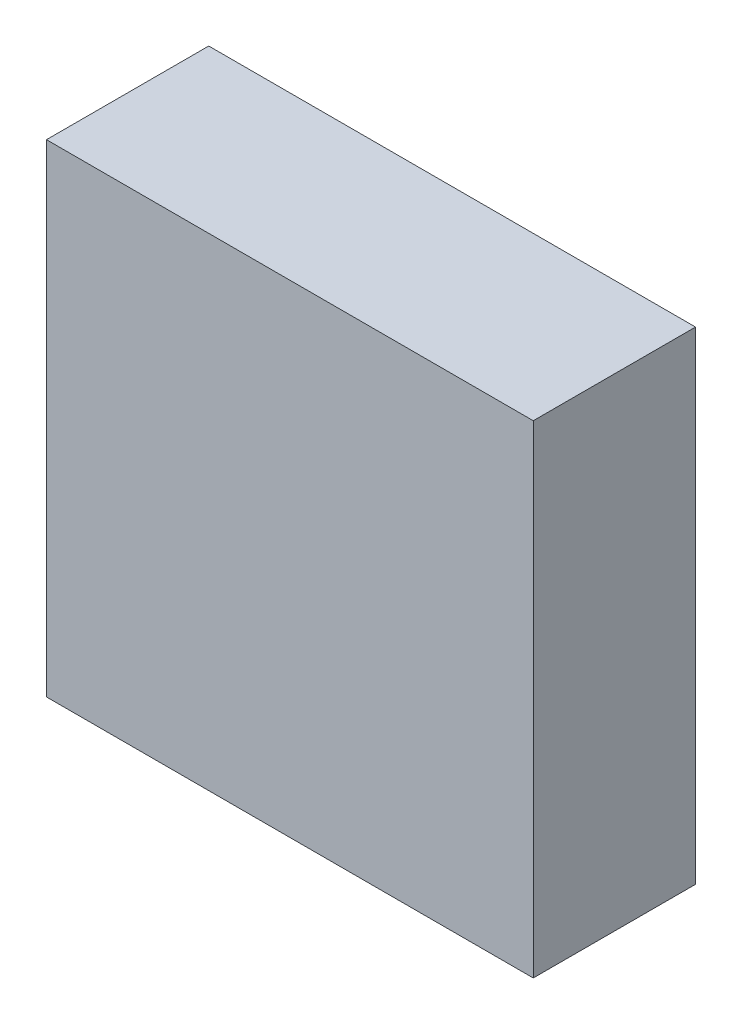
ISO-10303-21;
HEADER;
FILE_DESCRIPTION(('STEP AP214'),'2;1');
FILE_NAME('part.step','',(''),(''),'','','');
FILE_SCHEMA(('AUTOMOTIVE_DESIGN { 1 0 10303 214 1 1 1 1 }'));
ENDSEC;
DATA;
#1=APPLICATION_CONTEXT('core data for automotive mechanical design processes');
#2=APPLICATION_PROTOCOL_DEFINITION('international standard','automotive_design',2000,#1);
#3=PRODUCT_CONTEXT('',#1,'mechanical');
#4=PRODUCT('Part','Part','',(#3));
#5=PRODUCT_RELATED_PRODUCT_CATEGORY('part','',(#4));
#6=PRODUCT_DEFINITION_FORMATION('','',#4);
#7=PRODUCT_DEFINITION_CONTEXT('part definition',#1,'design');
#8=PRODUCT_DEFINITION('design','',#6,#7);
#9=PRODUCT_DEFINITION_SHAPE('','',#8);
#10=(LENGTH_UNIT() NAMED_UNIT(*) SI_UNIT(.MILLI.,.METRE.));
#11=(NAMED_UNIT(*) PLANE_ANGLE_UNIT() SI_UNIT($,.RADIAN.));
#12=(NAMED_UNIT(*) SI_UNIT($,.STERADIAN.) SOLID_ANGLE_UNIT());
#13=UNCERTAINTY_MEASURE_WITH_UNIT(LENGTH_MEASURE(1.E-05),#10,'distance_accuracy_value','');
#14=(GEOMETRIC_REPRESENTATION_CONTEXT(3) GLOBAL_UNCERTAINTY_ASSIGNED_CONTEXT((#13)) GLOBAL_UNIT_ASSIGNED_CONTEXT((#10,
#11,#12)) REPRESENTATION_CONTEXT('',''));
#15=CARTESIAN_POINT('',(0.,0.,0.));
#16=DIRECTION('',(0.,0.,1.));
#17=DIRECTION('',(1.,0.,0.));
#18=AXIS2_PLACEMENT_3D('',#15,#16,#17);
#19=CARTESIAN_POINT('',(0.,-0.314445,1.2));
#20=DIRECTION('',(0.,0.,1.));
#21=DIRECTION('',(1.,0.,0.));
#22=AXIS2_PLACEMENT_3D('',#19,#20,#21);
#23=PLANE('',#22);
#24=DIRECTION('',(1.,0.,0.));
#25=VECTOR('',#24,1.);
#26=CARTESIAN_POINT('',(-1.8001,-2.09919,1.2));
#27=LINE('',#26,#25);
#28=CARTESIAN_POINT('',(-1.8001,-2.09919,1.2));
#29=VERTEX_POINT('',#28);
#30=CARTESIAN_POINT('',(1.8001,-2.09919,1.2));
#31=VERTEX_POINT('',#30);
#32=EDGE_CURVE('E90',#29,#31,#27,.T.);
#33=ORIENTED_EDGE('',*,*,#32,.T.);
#34=DIRECTION('',(0.,1.,0.));
#35=VECTOR('',#34,1.);
#36=CARTESIAN_POINT('',(1.8001,-2.09919,1.2));
#37=LINE('',#36,#35);
#38=CARTESIAN_POINT('',(1.8001,1.4703,1.2));
#39=VERTEX_POINT('',#38);
#40=EDGE_CURVE('E99',#31,#39,#37,.T.);
#41=ORIENTED_EDGE('',*,*,#40,.T.);
#42=DIRECTION('',(-1.,0.,0.));
#43=VECTOR('',#42,1.);
#44=CARTESIAN_POINT('',(1.8001,1.4703,1.2));
#45=LINE('',#44,#43);
#46=CARTESIAN_POINT('',(-1.8001,1.4703,1.2));
#47=VERTEX_POINT('',#46);
#48=EDGE_CURVE('E75',#39,#47,#45,.T.);
#49=ORIENTED_EDGE('',*,*,#48,.T.);
#50=DIRECTION('',(0.,-1.,0.));
#51=VECTOR('',#50,1.);
#52=CARTESIAN_POINT('',(-1.8001,1.4703,1.2));
#53=LINE('',#52,#51);
#54=EDGE_CURVE('E11',#47,#29,#53,.T.);
#55=ORIENTED_EDGE('',*,*,#54,.T.);
#56=EDGE_LOOP('',(#33,#41,#49,#55));
#57=FACE_BOUND('',#56,.T.);
#58=ADVANCED_FACE('F16',(#57),#23,.T.);
#59=CARTESIAN_POINT('',(0.,-0.314445,0.));
#60=DIRECTION('',(0.,0.,1.));
#61=DIRECTION('',(1.,0.,0.));
#62=AXIS2_PLACEMENT_3D('',#59,#60,#61);
#63=PLANE('',#62);
#64=DIRECTION('',(1.,0.,0.));
#65=VECTOR('',#64,1.);
#66=CARTESIAN_POINT('',(-1.8001,-2.09919,0.));
#67=LINE('',#66,#65);
#68=CARTESIAN_POINT('',(-1.8001,-2.09919,0.));
#69=VERTEX_POINT('',#68);
#70=CARTESIAN_POINT('',(1.8001,-2.09919,0.));
#71=VERTEX_POINT('',#70);
#72=EDGE_CURVE('E78',#69,#71,#67,.T.);
#73=ORIENTED_EDGE('',*,*,#72,.F.);
#74=DIRECTION('',(0.,-1.,0.));
#75=VECTOR('',#74,1.);
#76=CARTESIAN_POINT('',(-1.8001,1.4703,0.));
#77=LINE('',#76,#75);
#78=CARTESIAN_POINT('',(-1.8001,1.4703,0.));
#79=VERTEX_POINT('',#78);
#80=EDGE_CURVE('E26',#79,#69,#77,.T.);
#81=ORIENTED_EDGE('',*,*,#80,.F.);
#82=DIRECTION('',(-1.,0.,0.));
#83=VECTOR('',#82,1.);
#84=CARTESIAN_POINT('',(1.8001,1.4703,0.));
#85=LINE('',#84,#83);
#86=CARTESIAN_POINT('',(1.8001,1.4703,0.));
#87=VERTEX_POINT('',#86);
#88=EDGE_CURVE('E97',#87,#79,#85,.T.);
#89=ORIENTED_EDGE('',*,*,#88,.F.);
#90=DIRECTION('',(0.,1.,0.));
#91=VECTOR('',#90,1.);
#92=CARTESIAN_POINT('',(1.8001,-2.09919,0.));
#93=LINE('',#92,#91);
#94=EDGE_CURVE('E81',#71,#87,#93,.T.);
#95=ORIENTED_EDGE('',*,*,#94,.F.);
#96=EDGE_LOOP('',(#73,#81,#89,#95));
#97=FACE_BOUND('',#96,.T.);
#98=ADVANCED_FACE('F79',(#97),#63,.F.);
#99=CARTESIAN_POINT('',(-1.8001,1.4703,0.));
#100=DIRECTION('',(1.,0.,0.));
#101=DIRECTION('',(0.,1.,0.));
#102=AXIS2_PLACEMENT_3D('',#99,#100,#101);
#103=PLANE('',#102);
#104=DIRECTION('',(0.,0.,1.));
#105=VECTOR('',#104,1.);
#106=CARTESIAN_POINT('',(-1.8001,1.4703,0.));
#107=LINE('',#106,#105);
#108=EDGE_CURVE('E72',#79,#47,#107,.T.);
#109=ORIENTED_EDGE('',*,*,#108,.F.);
#110=ORIENTED_EDGE('',*,*,#80,.T.);
#111=DIRECTION('',(0.,0.,1.));
#112=VECTOR('',#111,1.);
#113=CARTESIAN_POINT('',(-1.8001,-2.09919,0.));
#114=LINE('',#113,#112);
#115=EDGE_CURVE('E70',#69,#29,#114,.T.);
#116=ORIENTED_EDGE('',*,*,#115,.T.);
#117=ORIENTED_EDGE('',*,*,#54,.F.);
#118=EDGE_LOOP('',(#109,#110,#116,#117));
#119=FACE_BOUND('',#118,.T.);
#120=ADVANCED_FACE('F68',(#119),#103,.F.);
#121=CARTESIAN_POINT('',(1.8001,1.4703,0.));
#122=DIRECTION('',(0.,-1.,0.));
#123=DIRECTION('',(0.,0.,-1.));
#124=AXIS2_PLACEMENT_3D('',#121,#122,#123);
#125=PLANE('',#124);
#126=DIRECTION('',(0.,0.,1.));
#127=VECTOR('',#126,1.);
#128=CARTESIAN_POINT('',(1.8001,1.4703,0.));
#129=LINE('',#128,#127);
#130=EDGE_CURVE('E20',#87,#39,#129,.T.);
#131=ORIENTED_EDGE('',*,*,#130,.F.);
#132=ORIENTED_EDGE('',*,*,#88,.T.);
#133=ORIENTED_EDGE('',*,*,#108,.T.);
#134=ORIENTED_EDGE('',*,*,#48,.F.);
#135=EDGE_LOOP('',(#131,#132,#133,#134));
#136=FACE_BOUND('',#135,.T.);
#137=ADVANCED_FACE('F114',(#136),#125,.F.);
#138=CARTESIAN_POINT('',(1.8001,-2.09919,0.));
#139=DIRECTION('',(-1.,0.,0.));
#140=DIRECTION('',(0.,0.,1.));
#141=AXIS2_PLACEMENT_3D('',#138,#139,#140);
#142=PLANE('',#141);
#143=DIRECTION('',(0.,0.,1.));
#144=VECTOR('',#143,1.);
#145=CARTESIAN_POINT('',(1.8001,-2.09919,0.));
#146=LINE('',#145,#144);
#147=EDGE_CURVE('E86',#71,#31,#146,.T.);
#148=ORIENTED_EDGE('',*,*,#147,.F.);
#149=ORIENTED_EDGE('',*,*,#94,.T.);
#150=ORIENTED_EDGE('',*,*,#130,.T.);
#151=ORIENTED_EDGE('',*,*,#40,.F.);
#152=EDGE_LOOP('',(#148,#149,#150,#151));
#153=FACE_BOUND('',#152,.T.);
#154=ADVANCED_FACE('F117',(#153),#142,.F.);
#155=CARTESIAN_POINT('',(-1.8001,-2.09919,0.));
#156=DIRECTION('',(0.,1.,0.));
#157=DIRECTION('',(1.,0.,0.));
#158=AXIS2_PLACEMENT_3D('',#155,#156,#157);
#159=PLANE('',#158);
#160=ORIENTED_EDGE('',*,*,#115,.F.);
#161=ORIENTED_EDGE('',*,*,#72,.T.);
#162=ORIENTED_EDGE('',*,*,#147,.T.);
#163=ORIENTED_EDGE('',*,*,#32,.F.);
#164=EDGE_LOOP('',(#160,#161,#162,#163));
#165=FACE_BOUND('',#164,.T.);
#166=ADVANCED_FACE('F18',(#165),#159,.F.);
#167=CLOSED_SHELL('',(#58,#98,#120,#137,#154,#166));
#168=MANIFOLD_SOLID_BREP('B1',#167);
#169=ADVANCED_BREP_SHAPE_REPRESENTATION('',(#18,#168),#14);
#170=SHAPE_DEFINITION_REPRESENTATION(#9,#169);
ENDSEC;
END-ISO-10303-21;
